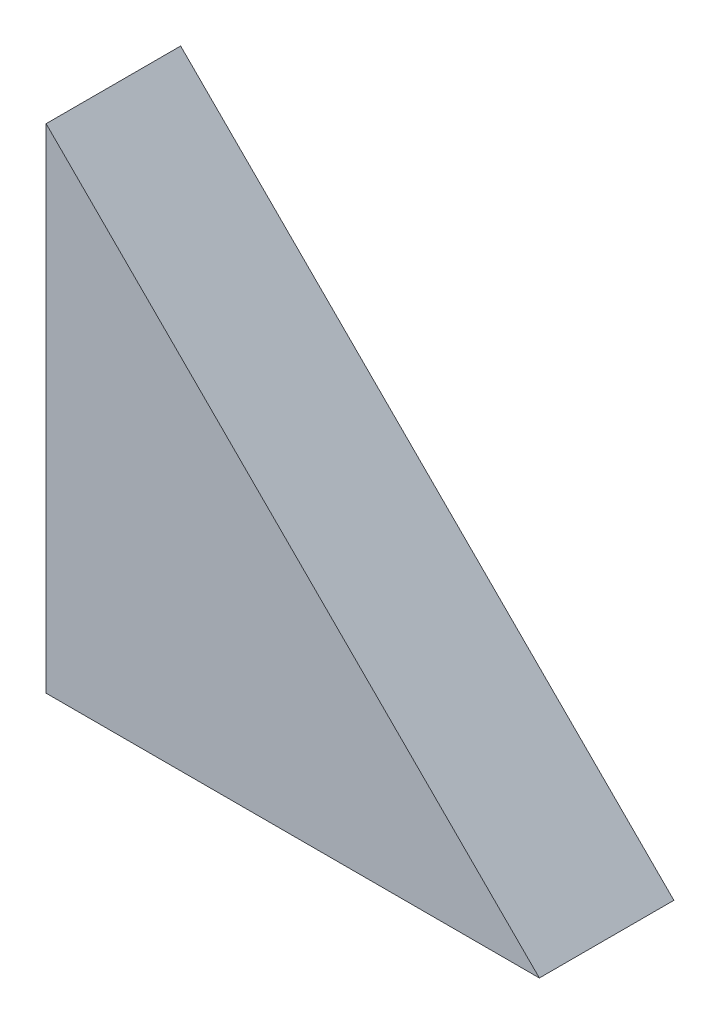
ISO-10303-21;
HEADER;
FILE_DESCRIPTION(('STEP AP214'),'2;1');
FILE_NAME('part.step','',(''),(''),'','','');
FILE_SCHEMA(('AUTOMOTIVE_DESIGN { 1 0 10303 214 1 1 1 1 }'));
ENDSEC;
DATA;
#1=APPLICATION_CONTEXT('core data for automotive mechanical design processes');
#2=APPLICATION_PROTOCOL_DEFINITION('international standard','automotive_design',2000,#1);
#3=PRODUCT_CONTEXT('',#1,'mechanical');
#4=PRODUCT('Part','Part','',(#3));
#5=PRODUCT_RELATED_PRODUCT_CATEGORY('part','',(#4));
#6=PRODUCT_DEFINITION_FORMATION('','',#4);
#7=PRODUCT_DEFINITION_CONTEXT('part definition',#1,'design');
#8=PRODUCT_DEFINITION('design','',#6,#7);
#9=PRODUCT_DEFINITION_SHAPE('','',#8);
#10=(LENGTH_UNIT() NAMED_UNIT(*) SI_UNIT(.MILLI.,.METRE.));
#11=(NAMED_UNIT(*) PLANE_ANGLE_UNIT() SI_UNIT($,.RADIAN.));
#12=(NAMED_UNIT(*) SI_UNIT($,.STERADIAN.) SOLID_ANGLE_UNIT());
#13=UNCERTAINTY_MEASURE_WITH_UNIT(LENGTH_MEASURE(1.E-05),#10,'distance_accuracy_value','');
#14=(GEOMETRIC_REPRESENTATION_CONTEXT(3) GLOBAL_UNCERTAINTY_ASSIGNED_CONTEXT((#13)) GLOBAL_UNIT_ASSIGNED_CONTEXT((#10,
#11,#12)) REPRESENTATION_CONTEXT('',''));
#15=CARTESIAN_POINT('',(0.,0.,0.));
#16=DIRECTION('',(0.,0.,1.));
#17=DIRECTION('',(1.,0.,0.));
#18=AXIS2_PLACEMENT_3D('',#15,#16,#17);
#19=CARTESIAN_POINT('',(11.,0.,1.5));
#20=DIRECTION('',(0.,1.,0.));
#21=DIRECTION('',(-1.,0.,0.));
#22=AXIS2_PLACEMENT_3D('',#19,#20,#21);
#23=PLANE('',#22);
#24=DIRECTION('',(1.,0.,0.));
#25=VECTOR('',#24,1.);
#26=CARTESIAN_POINT('',(11.,0.,-1.5));
#27=LINE('',#26,#25);
#28=CARTESIAN_POINT('',(0.,0.,-1.5));
#29=VERTEX_POINT('',#28);
#30=CARTESIAN_POINT('',(11.,0.,-1.5));
#31=VERTEX_POINT('',#30);
#32=EDGE_CURVE('E88',#29,#31,#27,.T.);
#33=ORIENTED_EDGE('',*,*,#32,.T.);
#34=DIRECTION('',(0.,0.,-1.));
#35=VECTOR('',#34,1.);
#36=CARTESIAN_POINT('',(11.,0.,1.5));
#37=LINE('',#36,#35);
#38=CARTESIAN_POINT('',(11.,0.,1.5));
#39=VERTEX_POINT('',#38);
#40=EDGE_CURVE('E11',#39,#31,#37,.T.);
#41=ORIENTED_EDGE('',*,*,#40,.F.);
#42=DIRECTION('',(1.,0.,0.));
#43=VECTOR('',#42,1.);
#44=CARTESIAN_POINT('',(11.,0.,1.5));
#45=LINE('',#44,#43);
#46=CARTESIAN_POINT('',(0.,0.,1.5));
#47=VERTEX_POINT('',#46);
#48=EDGE_CURVE('E81',#47,#39,#45,.T.);
#49=ORIENTED_EDGE('',*,*,#48,.F.);
#50=DIRECTION('',(0.,0.,-1.));
#51=VECTOR('',#50,1.);
#52=CARTESIAN_POINT('',(0.,0.,1.5));
#53=LINE('',#52,#51);
#54=EDGE_CURVE('E89',#47,#29,#53,.T.);
#55=ORIENTED_EDGE('',*,*,#54,.T.);
#56=EDGE_LOOP('',(#33,#41,#49,#55));
#57=FACE_BOUND('',#56,.T.);
#58=ADVANCED_FACE('F41',(#57),#23,.F.);
#59=CARTESIAN_POINT('',(0.,11.,1.5));
#60=DIRECTION('',(-0.707106781186547,-0.707106781186547,0.));
#61=DIRECTION('',(0.707106781186548,-0.707106781186548,0.));
#62=AXIS2_PLACEMENT_3D('',#59,#60,#61);
#63=PLANE('',#62);
#64=DIRECTION('',(-0.707106781186548,0.707106781186548,0.));
#65=VECTOR('',#64,1.);
#66=CARTESIAN_POINT('',(0.,11.,-1.5));
#67=LINE('',#66,#65);
#68=CARTESIAN_POINT('',(0.,11.,-1.5));
#69=VERTEX_POINT('',#68);
#70=EDGE_CURVE('E69',#31,#69,#67,.T.);
#71=ORIENTED_EDGE('',*,*,#70,.T.);
#72=DIRECTION('',(0.,0.,-1.));
#73=VECTOR('',#72,1.);
#74=CARTESIAN_POINT('',(0.,11.,1.5));
#75=LINE('',#74,#73);
#76=CARTESIAN_POINT('',(0.,11.,1.5));
#77=VERTEX_POINT('',#76);
#78=EDGE_CURVE('E49',#77,#69,#75,.T.);
#79=ORIENTED_EDGE('',*,*,#78,.F.);
#80=DIRECTION('',(-0.707106781186548,0.707106781186548,0.));
#81=VECTOR('',#80,1.);
#82=CARTESIAN_POINT('',(0.,11.,1.5));
#83=LINE('',#82,#81);
#84=EDGE_CURVE('E77',#39,#77,#83,.T.);
#85=ORIENTED_EDGE('',*,*,#84,.F.);
#86=ORIENTED_EDGE('',*,*,#40,.T.);
#87=EDGE_LOOP('',(#71,#79,#85,#86));
#88=FACE_BOUND('',#87,.T.);
#89=ADVANCED_FACE('F78',(#88),#63,.F.);
#90=CARTESIAN_POINT('',(0.,0.,1.5));
#91=DIRECTION('',(1.,0.,0.));
#92=DIRECTION('',(0.,0.,-1.));
#93=AXIS2_PLACEMENT_3D('',#90,#91,#92);
#94=PLANE('',#93);
#95=DIRECTION('',(0.,-1.,0.));
#96=VECTOR('',#95,1.);
#97=CARTESIAN_POINT('',(0.,0.,-1.5));
#98=LINE('',#97,#96);
#99=EDGE_CURVE('E74',#69,#29,#98,.T.);
#100=ORIENTED_EDGE('',*,*,#99,.T.);
#101=ORIENTED_EDGE('',*,*,#54,.F.);
#102=DIRECTION('',(0.,-1.,0.));
#103=VECTOR('',#102,1.);
#104=CARTESIAN_POINT('',(0.,0.,1.5));
#105=LINE('',#104,#103);
#106=EDGE_CURVE('E57',#77,#47,#105,.T.);
#107=ORIENTED_EDGE('',*,*,#106,.F.);
#108=ORIENTED_EDGE('',*,*,#78,.T.);
#109=EDGE_LOOP('',(#100,#101,#107,#108));
#110=FACE_BOUND('',#109,.T.);
#111=ADVANCED_FACE('F96',(#110),#94,.F.);
#112=CARTESIAN_POINT('',(0.,0.,1.5));
#113=DIRECTION('',(0.,0.,-1.));
#114=DIRECTION('',(-1.,0.,0.));
#115=AXIS2_PLACEMENT_3D('',#112,#113,#114);
#116=PLANE('',#115);
#117=ORIENTED_EDGE('',*,*,#48,.T.);
#118=ORIENTED_EDGE('',*,*,#84,.T.);
#119=ORIENTED_EDGE('',*,*,#106,.T.);
#120=EDGE_LOOP('',(#117,#118,#119));
#121=FACE_BOUND('',#120,.T.);
#122=ADVANCED_FACE('F84',(#121),#116,.F.);
#123=CARTESIAN_POINT('',(0.,0.,-1.5));
#124=DIRECTION('',(0.,0.,-1.));
#125=DIRECTION('',(-1.,0.,0.));
#126=AXIS2_PLACEMENT_3D('',#123,#124,#125);
#127=PLANE('',#126);
#128=ORIENTED_EDGE('',*,*,#32,.F.);
#129=ORIENTED_EDGE('',*,*,#99,.F.);
#130=ORIENTED_EDGE('',*,*,#70,.F.);
#131=EDGE_LOOP('',(#128,#129,#130));
#132=FACE_BOUND('',#131,.T.);
#133=ADVANCED_FACE('F97',(#132),#127,.T.);
#134=CLOSED_SHELL('',(#58,#89,#111,#122,#133));
#135=MANIFOLD_SOLID_BREP('B2',#134);
#136=ADVANCED_BREP_SHAPE_REPRESENTATION('',(#18,#135),#14);
#137=SHAPE_DEFINITION_REPRESENTATION(#9,#136);
ENDSEC;
END-ISO-10303-21;
